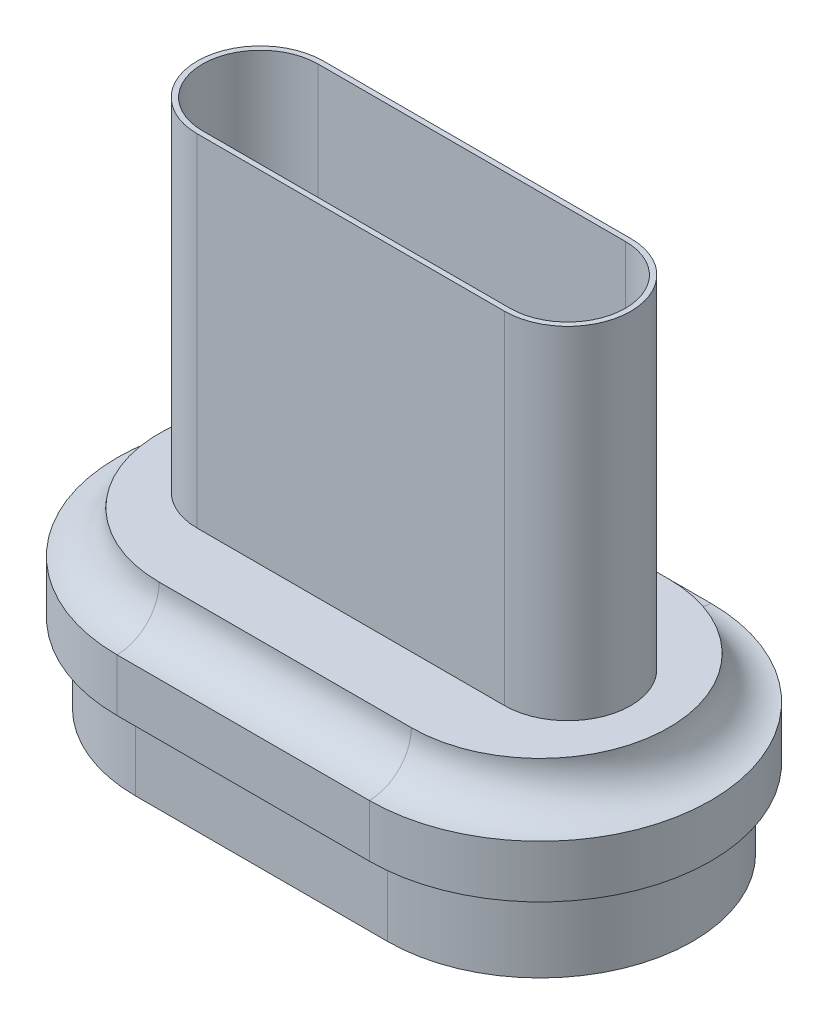
ISO-10303-21;
HEADER;
FILE_DESCRIPTION(('STEP AP214'),'2;1');
FILE_NAME('part.step','',(''),(''),'','','');
FILE_SCHEMA(('AUTOMOTIVE_DESIGN { 1 0 10303 214 1 1 1 1 }'));
ENDSEC;
DATA;
#1=APPLICATION_CONTEXT('core data for automotive mechanical design processes');
#2=APPLICATION_PROTOCOL_DEFINITION('international standard','automotive_design',2000,#1);
#3=PRODUCT_CONTEXT('',#1,'mechanical');
#4=PRODUCT('Part','Part','',(#3));
#5=PRODUCT_RELATED_PRODUCT_CATEGORY('part','',(#4));
#6=PRODUCT_DEFINITION_FORMATION('','',#4);
#7=PRODUCT_DEFINITION_CONTEXT('part definition',#1,'design');
#8=PRODUCT_DEFINITION('design','',#6,#7);
#9=PRODUCT_DEFINITION_SHAPE('','',#8);
#10=(LENGTH_UNIT() NAMED_UNIT(*) SI_UNIT(.MILLI.,.METRE.));
#11=(NAMED_UNIT(*) PLANE_ANGLE_UNIT() SI_UNIT($,.RADIAN.));
#12=(NAMED_UNIT(*) SI_UNIT($,.STERADIAN.) SOLID_ANGLE_UNIT());
#13=UNCERTAINTY_MEASURE_WITH_UNIT(LENGTH_MEASURE(1.E-05),#10,'distance_accuracy_value','');
#14=(GEOMETRIC_REPRESENTATION_CONTEXT(3) GLOBAL_UNCERTAINTY_ASSIGNED_CONTEXT((#13)) GLOBAL_UNIT_ASSIGNED_CONTEXT((#10,
#11,#12)) REPRESENTATION_CONTEXT('',''));
#15=CARTESIAN_POINT('',(0.,0.,0.));
#16=DIRECTION('',(0.,0.,1.));
#17=DIRECTION('',(1.,0.,0.));
#18=AXIS2_PLACEMENT_3D('',#15,#16,#17);
#19=CARTESIAN_POINT('',(-2.4,3.3,0.));
#20=DIRECTION('',(0.,1.,0.));
#21=DIRECTION('',(0.,0.,1.));
#22=AXIS2_PLACEMENT_3D('',#19,#20,#21);
#23=PLANE('',#22);
#24=CARTESIAN_POINT('',(-2.4,3.3,0.));
#25=DIRECTION('',(0.,1.,0.));
#26=DIRECTION('',(0.,0.,1.));
#27=AXIS2_PLACEMENT_3D('',#24,#25,#26);
#28=CIRCLE('',#27,2.45);
#29=CARTESIAN_POINT('',(-2.4,3.3,-2.45));
#30=VERTEX_POINT('',#29);
#31=CARTESIAN_POINT('',(-2.4,3.3,2.45));
#32=VERTEX_POINT('',#31);
#33=EDGE_CURVE('E256',#30,#32,#28,.T.);
#34=ORIENTED_EDGE('',*,*,#33,.T.);
#35=DIRECTION('',(1.,0.,0.));
#36=VECTOR('',#35,1.);
#37=CARTESIAN_POINT('',(-2.4,3.3,2.45));
#38=LINE('',#37,#36);
#39=CARTESIAN_POINT('',(2.4,3.3,2.45));
#40=VERTEX_POINT('',#39);
#41=EDGE_CURVE('E259',#32,#40,#38,.T.);
#42=ORIENTED_EDGE('',*,*,#41,.T.);
#43=CARTESIAN_POINT('',(2.4,3.3,0.));
#44=DIRECTION('',(0.,1.,0.));
#45=DIRECTION('',(0.,0.,1.));
#46=AXIS2_PLACEMENT_3D('',#43,#44,#45);
#47=CIRCLE('',#46,2.45);
#48=CARTESIAN_POINT('',(2.4,3.3,-2.45));
#49=VERTEX_POINT('',#48);
#50=EDGE_CURVE('E261',#40,#49,#47,.T.);
#51=ORIENTED_EDGE('',*,*,#50,.T.);
#52=DIRECTION('',(-1.,0.,0.));
#53=VECTOR('',#52,1.);
#54=CARTESIAN_POINT('',(2.4,3.3,-2.45));
#55=LINE('',#54,#53);
#56=EDGE_CURVE('E263',#49,#30,#55,.T.);
#57=ORIENTED_EDGE('',*,*,#56,.T.);
#58=EDGE_LOOP('',(#34,#42,#51,#57));
#59=FACE_BOUND('',#58,.T.);
#60=DIRECTION('',(1.,0.,0.));
#61=VECTOR('',#60,1.);
#62=CARTESIAN_POINT('',(2.925,3.3,1.2));
#63=LINE('',#62,#61);
#64=CARTESIAN_POINT('',(-2.925,3.3,1.2));
#65=VERTEX_POINT('',#64);
#66=CARTESIAN_POINT('',(2.925,3.3,1.2));
#67=VERTEX_POINT('',#66);
#68=EDGE_CURVE('E243',#65,#67,#63,.T.);
#69=ORIENTED_EDGE('',*,*,#68,.F.);
#70=CARTESIAN_POINT('',(-2.925,3.3,0.));
#71=DIRECTION('',(0.,1.,0.));
#72=DIRECTION('',(0.,0.,-1.));
#73=AXIS2_PLACEMENT_3D('',#70,#71,#72);
#74=CIRCLE('',#73,1.2);
#75=CARTESIAN_POINT('',(-2.925,3.3,-1.2));
#76=VERTEX_POINT('',#75);
#77=EDGE_CURVE('E208',#76,#65,#74,.T.);
#78=ORIENTED_EDGE('',*,*,#77,.F.);
#79=DIRECTION('',(-1.,0.,0.));
#80=VECTOR('',#79,1.);
#81=CARTESIAN_POINT('',(-2.925,3.3,-1.2));
#82=LINE('',#81,#80);
#83=CARTESIAN_POINT('',(2.925,3.3,-1.2));
#84=VERTEX_POINT('',#83);
#85=EDGE_CURVE('E234',#84,#76,#82,.T.);
#86=ORIENTED_EDGE('',*,*,#85,.F.);
#87=CARTESIAN_POINT('',(2.925,3.3,0.));
#88=DIRECTION('',(0.,1.,0.));
#89=DIRECTION('',(0.,0.,-1.));
#90=AXIS2_PLACEMENT_3D('',#87,#88,#89);
#91=CIRCLE('',#90,1.2);
#92=EDGE_CURVE('E245',#67,#84,#91,.T.);
#93=ORIENTED_EDGE('',*,*,#92,.F.);
#94=EDGE_LOOP('',(#69,#78,#86,#93));
#95=FACE_BOUND('',#94,.T.);
#96=ADVANCED_FACE('F38',(#59,#95),#23,.T.);
#97=CARTESIAN_POINT('',(-2.4,0.,0.));
#98=DIRECTION('',(0.,1.,0.));
#99=DIRECTION('',(0.,0.,1.));
#100=AXIS2_PLACEMENT_3D('',#97,#98,#99);
#101=PLANE('',#100);
#102=CARTESIAN_POINT('',(-2.4,0.,0.));
#103=DIRECTION('',(0.,1.,0.));
#104=DIRECTION('',(0.,0.,1.));
#105=AXIS2_PLACEMENT_3D('',#102,#103,#104);
#106=CIRCLE('',#105,2.9);
#107=CARTESIAN_POINT('',(-2.4,0.,-2.9));
#108=VERTEX_POINT('',#107);
#109=CARTESIAN_POINT('',(-2.4,0.,2.9));
#110=VERTEX_POINT('',#109);
#111=EDGE_CURVE('E332',#108,#110,#106,.T.);
#112=ORIENTED_EDGE('',*,*,#111,.F.);
#113=DIRECTION('',(-1.,0.,0.));
#114=VECTOR('',#113,1.);
#115=CARTESIAN_POINT('',(-2.4,0.,-2.9));
#116=LINE('',#115,#114);
#117=CARTESIAN_POINT('',(2.4,0.,-2.9));
#118=VERTEX_POINT('',#117);
#119=EDGE_CURVE('E337',#118,#108,#116,.T.);
#120=ORIENTED_EDGE('',*,*,#119,.F.);
#121=CARTESIAN_POINT('',(2.4,0.,0.));
#122=DIRECTION('',(0.,1.,0.));
#123=DIRECTION('',(0.,0.,1.));
#124=AXIS2_PLACEMENT_3D('',#121,#122,#123);
#125=CIRCLE('',#124,2.9);
#126=CARTESIAN_POINT('',(2.4,0.,2.9));
#127=VERTEX_POINT('',#126);
#128=EDGE_CURVE('E351',#127,#118,#125,.T.);
#129=ORIENTED_EDGE('',*,*,#128,.F.);
#130=DIRECTION('',(1.,0.,0.));
#131=VECTOR('',#130,1.);
#132=CARTESIAN_POINT('',(-2.4,0.,2.9));
#133=LINE('',#132,#131);
#134=EDGE_CURVE('E349',#110,#127,#133,.T.);
#135=ORIENTED_EDGE('',*,*,#134,.F.);
#136=EDGE_LOOP('',(#112,#120,#129,#135));
#137=FACE_BOUND('',#136,.T.);
#138=CARTESIAN_POINT('',(-2.4,0.,0.));
#139=DIRECTION('',(0.,1.,0.));
#140=DIRECTION('',(0.,0.,1.));
#141=AXIS2_PLACEMENT_3D('',#138,#139,#140);
#142=CIRCLE('',#141,1.4);
#143=CARTESIAN_POINT('',(-2.4,0.,-1.4));
#144=VERTEX_POINT('',#143);
#145=CARTESIAN_POINT('',(-2.4,0.,1.4));
#146=VERTEX_POINT('',#145);
#147=EDGE_CURVE('E298',#144,#146,#142,.T.);
#148=ORIENTED_EDGE('',*,*,#147,.T.);
#149=DIRECTION('',(1.,0.,0.));
#150=VECTOR('',#149,1.);
#151=CARTESIAN_POINT('',(-2.4,0.,1.4));
#152=LINE('',#151,#150);
#153=CARTESIAN_POINT('',(2.4,0.,1.4));
#154=VERTEX_POINT('',#153);
#155=EDGE_CURVE('E315',#146,#154,#152,.T.);
#156=ORIENTED_EDGE('',*,*,#155,.T.);
#157=CARTESIAN_POINT('',(2.4,0.,0.));
#158=DIRECTION('',(0.,1.,0.));
#159=DIRECTION('',(0.,0.,1.));
#160=AXIS2_PLACEMENT_3D('',#157,#158,#159);
#161=CIRCLE('',#160,1.4);
#162=CARTESIAN_POINT('',(2.4,0.,-1.4));
#163=VERTEX_POINT('',#162);
#164=EDGE_CURVE('E318',#154,#163,#161,.T.);
#165=ORIENTED_EDGE('',*,*,#164,.T.);
#166=DIRECTION('',(-1.,0.,0.));
#167=VECTOR('',#166,1.);
#168=CARTESIAN_POINT('',(-2.4,0.,-1.4));
#169=LINE('',#168,#167);
#170=EDGE_CURVE('E303',#163,#144,#169,.T.);
#171=ORIENTED_EDGE('',*,*,#170,.T.);
#172=EDGE_LOOP('',(#148,#156,#165,#171));
#173=FACE_BOUND('',#172,.T.);
#174=ADVANCED_FACE('F398',(#137,#173),#101,.F.);
#175=CARTESIAN_POINT('',(-2.4,1.5,0.));
#176=DIRECTION('',(0.,-1.,0.));
#177=DIRECTION('',(0.,0.,-1.));
#178=AXIS2_PLACEMENT_3D('',#175,#176,#177);
#179=CYLINDRICAL_SURFACE('',#178,2.9);
#180=ORIENTED_EDGE('',*,*,#111,.T.);
#181=DIRECTION('',(0.,-1.,0.));
#182=VECTOR('',#181,1.);
#183=CARTESIAN_POINT('',(-2.4,1.5,2.9));
#184=LINE('',#183,#182);
#185=CARTESIAN_POINT('',(-2.4,1.5,2.9));
#186=VERTEX_POINT('',#185);
#187=EDGE_CURVE('E11',#186,#110,#184,.T.);
#188=ORIENTED_EDGE('',*,*,#187,.F.);
#189=CARTESIAN_POINT('',(-2.4,1.5,0.));
#190=DIRECTION('',(0.,1.,0.));
#191=DIRECTION('',(0.,0.,1.));
#192=AXIS2_PLACEMENT_3D('',#189,#190,#191);
#193=CIRCLE('',#192,2.9);
#194=CARTESIAN_POINT('',(-2.4,1.5,-2.9));
#195=VERTEX_POINT('',#194);
#196=EDGE_CURVE('E333',#195,#186,#193,.T.);
#197=ORIENTED_EDGE('',*,*,#196,.F.);
#198=DIRECTION('',(0.,-1.,0.));
#199=VECTOR('',#198,1.);
#200=CARTESIAN_POINT('',(-2.4,1.5,-2.9));
#201=LINE('',#200,#199);
#202=EDGE_CURVE('E346',#195,#108,#201,.T.);
#203=ORIENTED_EDGE('',*,*,#202,.T.);
#204=EDGE_LOOP('',(#180,#188,#197,#203));
#205=FACE_BOUND('',#204,.T.);
#206=ADVANCED_FACE('F468',(#205),#179,.T.);
#207=CARTESIAN_POINT('',(-2.4,1.5,2.9));
#208=DIRECTION('',(0.,0.,-1.));
#209=DIRECTION('',(-1.,0.,0.));
#210=AXIS2_PLACEMENT_3D('',#207,#208,#209);
#211=PLANE('',#210);
#212=ORIENTED_EDGE('',*,*,#134,.T.);
#213=DIRECTION('',(0.,-1.,0.));
#214=VECTOR('',#213,1.);
#215=CARTESIAN_POINT('',(2.4,1.5,2.9));
#216=LINE('',#215,#214);
#217=CARTESIAN_POINT('',(2.4,1.5,2.9));
#218=VERTEX_POINT('',#217);
#219=EDGE_CURVE('E47',#218,#127,#216,.T.);
#220=ORIENTED_EDGE('',*,*,#219,.F.);
#221=DIRECTION('',(1.,0.,0.));
#222=VECTOR('',#221,1.);
#223=CARTESIAN_POINT('',(-2.4,1.5,2.9));
#224=LINE('',#223,#222);
#225=EDGE_CURVE('E336',#186,#218,#224,.T.);
#226=ORIENTED_EDGE('',*,*,#225,.F.);
#227=ORIENTED_EDGE('',*,*,#187,.T.);
#228=EDGE_LOOP('',(#212,#220,#226,#227));
#229=FACE_BOUND('',#228,.T.);
#230=ADVANCED_FACE('F476',(#229),#211,.F.);
#231=CARTESIAN_POINT('',(2.4,1.5,0.));
#232=DIRECTION('',(0.,-1.,0.));
#233=DIRECTION('',(0.,0.,-1.));
#234=AXIS2_PLACEMENT_3D('',#231,#232,#233);
#235=CYLINDRICAL_SURFACE('',#234,2.9);
#236=ORIENTED_EDGE('',*,*,#128,.T.);
#237=DIRECTION('',(0.,-1.,0.));
#238=VECTOR('',#237,1.);
#239=CARTESIAN_POINT('',(2.4,1.5,-2.9));
#240=LINE('',#239,#238);
#241=CARTESIAN_POINT('',(2.4,1.5,-2.9));
#242=VERTEX_POINT('',#241);
#243=EDGE_CURVE('E356',#242,#118,#240,.T.);
#244=ORIENTED_EDGE('',*,*,#243,.F.);
#245=CARTESIAN_POINT('',(2.4,1.5,0.));
#246=DIRECTION('',(0.,1.,0.));
#247=DIRECTION('',(0.,0.,1.));
#248=AXIS2_PLACEMENT_3D('',#245,#246,#247);
#249=CIRCLE('',#248,2.9);
#250=EDGE_CURVE('E340',#218,#242,#249,.T.);
#251=ORIENTED_EDGE('',*,*,#250,.F.);
#252=ORIENTED_EDGE('',*,*,#219,.T.);
#253=EDGE_LOOP('',(#236,#244,#251,#252));
#254=FACE_BOUND('',#253,.T.);
#255=ADVANCED_FACE('F472',(#254),#235,.T.);
#256=CARTESIAN_POINT('',(-2.4,1.5,-2.9));
#257=DIRECTION('',(0.,0.,1.));
#258=DIRECTION('',(1.,0.,0.));
#259=AXIS2_PLACEMENT_3D('',#256,#257,#258);
#260=PLANE('',#259);
#261=ORIENTED_EDGE('',*,*,#119,.T.);
#262=ORIENTED_EDGE('',*,*,#202,.F.);
#263=DIRECTION('',(-1.,0.,0.));
#264=VECTOR('',#263,1.);
#265=CARTESIAN_POINT('',(-2.4,1.5,-2.9));
#266=LINE('',#265,#264);
#267=EDGE_CURVE('E343',#242,#195,#266,.T.);
#268=ORIENTED_EDGE('',*,*,#267,.F.);
#269=ORIENTED_EDGE('',*,*,#243,.T.);
#270=EDGE_LOOP('',(#261,#262,#268,#269));
#271=FACE_BOUND('',#270,.T.);
#272=ADVANCED_FACE('F464',(#271),#260,.F.);
#273=CARTESIAN_POINT('',(-2.4,1.5,0.));
#274=DIRECTION('',(0.,-1.,0.));
#275=DIRECTION('',(0.,0.,-1.));
#276=AXIS2_PLACEMENT_3D('',#273,#274,#275);
#277=CYLINDRICAL_SURFACE('',#276,1.4);
#278=ORIENTED_EDGE('',*,*,#147,.F.);
#279=DIRECTION('',(0.,-1.,0.));
#280=VECTOR('',#279,1.);
#281=CARTESIAN_POINT('',(-2.4,1.5,-1.4));
#282=LINE('',#281,#280);
#283=CARTESIAN_POINT('',(-2.4,1.5,-1.4));
#284=VERTEX_POINT('',#283);
#285=EDGE_CURVE('E312',#284,#144,#282,.T.);
#286=ORIENTED_EDGE('',*,*,#285,.F.);
#287=CARTESIAN_POINT('',(-2.4,1.5,0.));
#288=DIRECTION('',(0.,1.,0.));
#289=DIRECTION('',(0.,0.,1.));
#290=AXIS2_PLACEMENT_3D('',#287,#288,#289);
#291=CIRCLE('',#290,1.4);
#292=CARTESIAN_POINT('',(-2.4,1.5,1.4));
#293=VERTEX_POINT('',#292);
#294=EDGE_CURVE('E299',#284,#293,#291,.T.);
#295=ORIENTED_EDGE('',*,*,#294,.T.);
#296=DIRECTION('',(0.,-1.,0.));
#297=VECTOR('',#296,1.);
#298=CARTESIAN_POINT('',(-2.4,1.5,1.4));
#299=LINE('',#298,#297);
#300=EDGE_CURVE('E329',#293,#146,#299,.T.);
#301=ORIENTED_EDGE('',*,*,#300,.T.);
#302=EDGE_LOOP('',(#278,#286,#295,#301));
#303=FACE_BOUND('',#302,.T.);
#304=ADVANCED_FACE('F460',(#303),#277,.F.);
#305=CARTESIAN_POINT('',(-2.4,1.5,1.4));
#306=DIRECTION('',(0.,0.,-1.));
#307=DIRECTION('',(-1.,0.,0.));
#308=AXIS2_PLACEMENT_3D('',#305,#306,#307);
#309=PLANE('',#308);
#310=ORIENTED_EDGE('',*,*,#155,.F.);
#311=ORIENTED_EDGE('',*,*,#300,.F.);
#312=DIRECTION('',(1.,0.,0.));
#313=VECTOR('',#312,1.);
#314=CARTESIAN_POINT('',(-2.4,1.5,1.4));
#315=LINE('',#314,#313);
#316=CARTESIAN_POINT('',(2.4,1.5,1.4));
#317=VERTEX_POINT('',#316);
#318=EDGE_CURVE('E302',#293,#317,#315,.T.);
#319=ORIENTED_EDGE('',*,*,#318,.T.);
#320=DIRECTION('',(0.,-1.,0.));
#321=VECTOR('',#320,1.);
#322=CARTESIAN_POINT('',(2.4,1.5,1.4));
#323=LINE('',#322,#321);
#324=EDGE_CURVE('E327',#317,#154,#323,.T.);
#325=ORIENTED_EDGE('',*,*,#324,.T.);
#326=EDGE_LOOP('',(#310,#311,#319,#325));
#327=FACE_BOUND('',#326,.T.);
#328=ADVANCED_FACE('F456',(#327),#309,.T.);
#329=CARTESIAN_POINT('',(2.4,1.5,0.));
#330=DIRECTION('',(0.,-1.,0.));
#331=DIRECTION('',(0.,0.,-1.));
#332=AXIS2_PLACEMENT_3D('',#329,#330,#331);
#333=CYLINDRICAL_SURFACE('',#332,1.4);
#334=ORIENTED_EDGE('',*,*,#164,.F.);
#335=ORIENTED_EDGE('',*,*,#324,.F.);
#336=CARTESIAN_POINT('',(2.4,1.5,0.));
#337=DIRECTION('',(0.,1.,0.));
#338=DIRECTION('',(0.,0.,1.));
#339=AXIS2_PLACEMENT_3D('',#336,#337,#338);
#340=CIRCLE('',#339,1.4);
#341=CARTESIAN_POINT('',(2.4,1.5,-1.4));
#342=VERTEX_POINT('',#341);
#343=EDGE_CURVE('E306',#317,#342,#340,.T.);
#344=ORIENTED_EDGE('',*,*,#343,.T.);
#345=DIRECTION('',(0.,-1.,0.));
#346=VECTOR('',#345,1.);
#347=CARTESIAN_POINT('',(2.4,1.5,-1.4));
#348=LINE('',#347,#346);
#349=EDGE_CURVE('E325',#342,#163,#348,.T.);
#350=ORIENTED_EDGE('',*,*,#349,.T.);
#351=EDGE_LOOP('',(#334,#335,#344,#350));
#352=FACE_BOUND('',#351,.T.);
#353=ADVANCED_FACE('F452',(#352),#333,.F.);
#354=CARTESIAN_POINT('',(-2.4,1.5,-1.4));
#355=DIRECTION('',(0.,0.,1.));
#356=DIRECTION('',(1.,0.,0.));
#357=AXIS2_PLACEMENT_3D('',#354,#355,#356);
#358=PLANE('',#357);
#359=ORIENTED_EDGE('',*,*,#170,.F.);
#360=ORIENTED_EDGE('',*,*,#349,.F.);
#361=DIRECTION('',(-1.,0.,0.));
#362=VECTOR('',#361,1.);
#363=CARTESIAN_POINT('',(-2.4,1.5,-1.4));
#364=LINE('',#363,#362);
#365=EDGE_CURVE('E309',#342,#284,#364,.T.);
#366=ORIENTED_EDGE('',*,*,#365,.T.);
#367=ORIENTED_EDGE('',*,*,#285,.T.);
#368=EDGE_LOOP('',(#359,#360,#366,#367));
#369=FACE_BOUND('',#368,.T.);
#370=ADVANCED_FACE('F449',(#369),#358,.T.);
#371=CARTESIAN_POINT('',(2.4,1.5,0.));
#372=DIRECTION('',(0.,1.,0.));
#373=DIRECTION('',(0.,0.,1.));
#374=AXIS2_PLACEMENT_3D('',#371,#372,#373);
#375=PLANE('',#374);
#376=ORIENTED_EDGE('',*,*,#318,.F.);
#377=ORIENTED_EDGE('',*,*,#294,.F.);
#378=ORIENTED_EDGE('',*,*,#365,.F.);
#379=ORIENTED_EDGE('',*,*,#343,.F.);
#380=EDGE_LOOP('',(#376,#377,#378,#379));
#381=FACE_BOUND('',#380,.T.);
#382=ADVANCED_FACE('F439',(#381),#375,.F.);
#383=CARTESIAN_POINT('',(2.4,2.5,0.));
#384=DIRECTION('',(0.,-1.,0.));
#385=DIRECTION('',(0.,0.,-1.));
#386=AXIS2_PLACEMENT_3D('',#383,#384,#385);
#387=CYLINDRICAL_SURFACE('',#386,3.25);
#388=CARTESIAN_POINT('',(2.4,1.5,0.));
#389=DIRECTION('',(0.,1.,0.));
#390=DIRECTION('',(0.,0.,1.));
#391=AXIS2_PLACEMENT_3D('',#388,#389,#390);
#392=CIRCLE('',#391,3.25);
#393=CARTESIAN_POINT('',(2.4,1.5,3.25));
#394=VERTEX_POINT('',#393);
#395=CARTESIAN_POINT('',(2.4,1.5,-3.25));
#396=VERTEX_POINT('',#395);
#397=EDGE_CURVE('E265',#394,#396,#392,.T.);
#398=ORIENTED_EDGE('',*,*,#397,.T.);
#399=DIRECTION('',(0.,-1.,0.));
#400=VECTOR('',#399,1.);
#401=CARTESIAN_POINT('',(2.4,2.5,-3.25));
#402=LINE('',#401,#400);
#403=CARTESIAN_POINT('',(2.4,2.5,-3.25));
#404=VERTEX_POINT('',#403);
#405=EDGE_CURVE('E295',#404,#396,#402,.T.);
#406=ORIENTED_EDGE('',*,*,#405,.F.);
#407=CARTESIAN_POINT('',(2.4,2.5,0.));
#408=DIRECTION('',(0.,1.,0.));
#409=DIRECTION('',(0.,0.,1.));
#410=AXIS2_PLACEMENT_3D('',#407,#408,#409);
#411=CIRCLE('',#410,3.25);
#412=CARTESIAN_POINT('',(2.4,2.5,3.25));
#413=VERTEX_POINT('',#412);
#414=EDGE_CURVE('E266',#413,#404,#411,.T.);
#415=ORIENTED_EDGE('',*,*,#414,.F.);
#416=DIRECTION('',(0.,-1.,0.));
#417=VECTOR('',#416,1.);
#418=CARTESIAN_POINT('',(2.4,2.5,3.25));
#419=LINE('',#418,#417);
#420=EDGE_CURVE('E279',#413,#394,#419,.T.);
#421=ORIENTED_EDGE('',*,*,#420,.T.);
#422=EDGE_LOOP('',(#398,#406,#415,#421));
#423=FACE_BOUND('',#422,.T.);
#424=ADVANCED_FACE('F381',(#423),#387,.T.);
#425=CARTESIAN_POINT('',(2.4,2.5,-3.25));
#426=DIRECTION('',(0.,0.,1.));
#427=DIRECTION('',(1.,0.,0.));
#428=AXIS2_PLACEMENT_3D('',#425,#426,#427);
#429=PLANE('',#428);
#430=DIRECTION('',(-1.,0.,0.));
#431=VECTOR('',#430,1.);
#432=CARTESIAN_POINT('',(2.4,1.5,-3.25));
#433=LINE('',#432,#431);
#434=CARTESIAN_POINT('',(-2.4,1.5,-3.25));
#435=VERTEX_POINT('',#434);
#436=EDGE_CURVE('E282',#396,#435,#433,.T.);
#437=ORIENTED_EDGE('',*,*,#436,.T.);
#438=DIRECTION('',(0.,-1.,0.));
#439=VECTOR('',#438,1.);
#440=CARTESIAN_POINT('',(-2.4,2.5,-3.25));
#441=LINE('',#440,#439);
#442=CARTESIAN_POINT('',(-2.4,2.5,-3.25));
#443=VERTEX_POINT('',#442);
#444=EDGE_CURVE('E292',#443,#435,#441,.T.);
#445=ORIENTED_EDGE('',*,*,#444,.F.);
#446=DIRECTION('',(-1.,0.,0.));
#447=VECTOR('',#446,1.);
#448=CARTESIAN_POINT('',(2.4,2.5,-3.25));
#449=LINE('',#448,#447);
#450=EDGE_CURVE('E269',#404,#443,#449,.T.);
#451=ORIENTED_EDGE('',*,*,#450,.F.);
#452=ORIENTED_EDGE('',*,*,#405,.T.);
#453=EDGE_LOOP('',(#437,#445,#451,#452));
#454=FACE_BOUND('',#453,.T.);
#455=ADVANCED_FACE('F384',(#454),#429,.F.);
#456=CARTESIAN_POINT('',(-2.4,2.5,0.));
#457=DIRECTION('',(0.,-1.,0.));
#458=DIRECTION('',(0.,0.,-1.));
#459=AXIS2_PLACEMENT_3D('',#456,#457,#458);
#460=CYLINDRICAL_SURFACE('',#459,3.25);
#461=CARTESIAN_POINT('',(-2.4,1.5,0.));
#462=DIRECTION('',(0.,1.,0.));
#463=DIRECTION('',(0.,0.,1.));
#464=AXIS2_PLACEMENT_3D('',#461,#462,#463);
#465=CIRCLE('',#464,3.25);
#466=CARTESIAN_POINT('',(-2.4,1.5,3.25));
#467=VERTEX_POINT('',#466);
#468=EDGE_CURVE('E284',#435,#467,#465,.T.);
#469=ORIENTED_EDGE('',*,*,#468,.T.);
#470=DIRECTION('',(0.,-1.,0.));
#471=VECTOR('',#470,1.);
#472=CARTESIAN_POINT('',(-2.4,2.5,3.25));
#473=LINE('',#472,#471);
#474=CARTESIAN_POINT('',(-2.4,2.5,3.25));
#475=VERTEX_POINT('',#474);
#476=EDGE_CURVE('E289',#475,#467,#473,.T.);
#477=ORIENTED_EDGE('',*,*,#476,.F.);
#478=CARTESIAN_POINT('',(-2.4,2.5,0.));
#479=DIRECTION('',(0.,1.,0.));
#480=DIRECTION('',(0.,0.,1.));
#481=AXIS2_PLACEMENT_3D('',#478,#479,#480);
#482=CIRCLE('',#481,3.25);
#483=EDGE_CURVE('E273',#443,#475,#482,.T.);
#484=ORIENTED_EDGE('',*,*,#483,.F.);
#485=ORIENTED_EDGE('',*,*,#444,.T.);
#486=EDGE_LOOP('',(#469,#477,#484,#485));
#487=FACE_BOUND('',#486,.T.);
#488=ADVANCED_FACE('F388',(#487),#460,.T.);
#489=CARTESIAN_POINT('',(-2.4,2.5,3.25));
#490=DIRECTION('',(0.,0.,-1.));
#491=DIRECTION('',(-1.,0.,0.));
#492=AXIS2_PLACEMENT_3D('',#489,#490,#491);
#493=PLANE('',#492);
#494=DIRECTION('',(1.,0.,0.));
#495=VECTOR('',#494,1.);
#496=CARTESIAN_POINT('',(-2.4,1.5,3.25));
#497=LINE('',#496,#495);
#498=EDGE_CURVE('E270',#467,#394,#497,.T.);
#499=ORIENTED_EDGE('',*,*,#498,.T.);
#500=ORIENTED_EDGE('',*,*,#420,.F.);
#501=DIRECTION('',(1.,0.,0.));
#502=VECTOR('',#501,1.);
#503=CARTESIAN_POINT('',(-2.4,2.5,3.25));
#504=LINE('',#503,#502);
#505=EDGE_CURVE('E276',#475,#413,#504,.T.);
#506=ORIENTED_EDGE('',*,*,#505,.F.);
#507=ORIENTED_EDGE('',*,*,#476,.T.);
#508=EDGE_LOOP('',(#499,#500,#506,#507));
#509=FACE_BOUND('',#508,.T.);
#510=ADVANCED_FACE('F437',(#509),#493,.F.);
#511=ORIENTED_EDGE('',*,*,#267,.T.);
#512=ORIENTED_EDGE('',*,*,#196,.T.);
#513=ORIENTED_EDGE('',*,*,#225,.T.);
#514=ORIENTED_EDGE('',*,*,#250,.T.);
#515=EDGE_LOOP('',(#511,#512,#513,#514));
#516=FACE_BOUND('',#515,.T.);
#517=ORIENTED_EDGE('',*,*,#397,.F.);
#518=ORIENTED_EDGE('',*,*,#498,.F.);
#519=ORIENTED_EDGE('',*,*,#468,.F.);
#520=ORIENTED_EDGE('',*,*,#436,.F.);
#521=EDGE_LOOP('',(#517,#518,#519,#520));
#522=FACE_BOUND('',#521,.T.);
#523=ADVANCED_FACE('F434',(#516,#522),#375,.F.);
#524=CARTESIAN_POINT('',(-2.925,9.8,0.));
#525=DIRECTION('',(0.,-1.,0.));
#526=DIRECTION('',(0.,0.,-1.));
#527=AXIS2_PLACEMENT_3D('',#524,#525,#526);
#528=PLANE('',#527);
#529=CARTESIAN_POINT('',(-2.925,9.8,0.));
#530=DIRECTION('',(0.,1.,0.));
#531=DIRECTION('',(0.,0.,-1.));
#532=AXIS2_PLACEMENT_3D('',#529,#530,#531);
#533=CIRCLE('',#532,1.2);
#534=CARTESIAN_POINT('',(-2.925,9.8,-1.2));
#535=VERTEX_POINT('',#534);
#536=CARTESIAN_POINT('',(-2.925,9.8,1.2));
#537=VERTEX_POINT('',#536);
#538=EDGE_CURVE('E230',#535,#537,#533,.T.);
#539=ORIENTED_EDGE('',*,*,#538,.T.);
#540=DIRECTION('',(1.,0.,0.));
#541=VECTOR('',#540,1.);
#542=CARTESIAN_POINT('',(2.925,9.8,1.2));
#543=LINE('',#542,#541);
#544=CARTESIAN_POINT('',(2.925,9.8,1.2));
#545=VERTEX_POINT('',#544);
#546=EDGE_CURVE('E233',#537,#545,#543,.T.);
#547=ORIENTED_EDGE('',*,*,#546,.T.);
#548=CARTESIAN_POINT('',(2.925,9.8,0.));
#549=DIRECTION('',(0.,1.,0.));
#550=DIRECTION('',(0.,0.,-1.));
#551=AXIS2_PLACEMENT_3D('',#548,#549,#550);
#552=CIRCLE('',#551,1.2);
#553=CARTESIAN_POINT('',(2.925,9.8,-1.2));
#554=VERTEX_POINT('',#553);
#555=EDGE_CURVE('E236',#545,#554,#552,.T.);
#556=ORIENTED_EDGE('',*,*,#555,.T.);
#557=DIRECTION('',(-1.,0.,0.));
#558=VECTOR('',#557,1.);
#559=CARTESIAN_POINT('',(-2.925,9.8,-1.2));
#560=LINE('',#559,#558);
#561=EDGE_CURVE('E238',#554,#535,#560,.T.);
#562=ORIENTED_EDGE('',*,*,#561,.T.);
#563=EDGE_LOOP('',(#539,#547,#556,#562));
#564=FACE_BOUND('',#563,.T.);
#565=CARTESIAN_POINT('',(-2.925,9.8,0.));
#566=DIRECTION('',(0.,1.,0.));
#567=DIRECTION('',(0.,0.,-1.));
#568=AXIS2_PLACEMENT_3D('',#565,#566,#567);
#569=CIRCLE('',#568,1.1);
#570=CARTESIAN_POINT('',(-2.925,9.8,-1.1));
#571=VERTEX_POINT('',#570);
#572=CARTESIAN_POINT('',(-2.925,9.8,1.1));
#573=VERTEX_POINT('',#572);
#574=EDGE_CURVE('E191',#571,#573,#569,.T.);
#575=ORIENTED_EDGE('',*,*,#574,.F.);
#576=DIRECTION('',(-1.,0.,0.));
#577=VECTOR('',#576,1.);
#578=CARTESIAN_POINT('',(-2.925,9.8,-1.1));
#579=LINE('',#578,#577);
#580=CARTESIAN_POINT('',(2.925,9.8,-1.1));
#581=VERTEX_POINT('',#580);
#582=EDGE_CURVE('E216',#581,#571,#579,.T.);
#583=ORIENTED_EDGE('',*,*,#582,.F.);
#584=CARTESIAN_POINT('',(2.925,9.8,0.));
#585=DIRECTION('',(0.,1.,0.));
#586=DIRECTION('',(0.,0.,-1.));
#587=AXIS2_PLACEMENT_3D('',#584,#585,#586);
#588=CIRCLE('',#587,1.1);
#589=CARTESIAN_POINT('',(2.925,9.8,1.1));
#590=VERTEX_POINT('',#589);
#591=EDGE_CURVE('E214',#590,#581,#588,.T.);
#592=ORIENTED_EDGE('',*,*,#591,.F.);
#593=DIRECTION('',(1.,0.,0.));
#594=VECTOR('',#593,1.);
#595=CARTESIAN_POINT('',(2.925,9.8,1.1));
#596=LINE('',#595,#594);
#597=EDGE_CURVE('E200',#573,#590,#596,.T.);
#598=ORIENTED_EDGE('',*,*,#597,.F.);
#599=EDGE_LOOP('',(#575,#583,#592,#598));
#600=FACE_BOUND('',#599,.T.);
#601=ADVANCED_FACE('F212',(#564,#600),#528,.F.);
#602=CARTESIAN_POINT('',(-2.925,9.8,0.));
#603=DIRECTION('',(0.,-1.,0.));
#604=DIRECTION('',(0.,0.,-1.));
#605=AXIS2_PLACEMENT_3D('',#602,#603,#604);
#606=CYLINDRICAL_SURFACE('',#605,1.2);
#607=ORIENTED_EDGE('',*,*,#77,.T.);
#608=DIRECTION('',(0.,-1.,0.));
#609=VECTOR('',#608,1.);
#610=CARTESIAN_POINT('',(-2.925,9.8,1.2));
#611=LINE('',#610,#609);
#612=EDGE_CURVE('E254',#537,#65,#611,.T.);
#613=ORIENTED_EDGE('',*,*,#612,.F.);
#614=ORIENTED_EDGE('',*,*,#538,.F.);
#615=DIRECTION('',(0.,-1.,0.));
#616=VECTOR('',#615,1.);
#617=CARTESIAN_POINT('',(-2.925,9.8,-1.2));
#618=LINE('',#617,#616);
#619=EDGE_CURVE('E240',#535,#76,#618,.T.);
#620=ORIENTED_EDGE('',*,*,#619,.T.);
#621=EDGE_LOOP('',(#607,#613,#614,#620));
#622=FACE_BOUND('',#621,.T.);
#623=ADVANCED_FACE('F416',(#622),#606,.T.);
#624=CARTESIAN_POINT('',(2.925,9.8,1.2));
#625=DIRECTION('',(0.,0.,-1.));
#626=DIRECTION('',(-1.,0.,0.));
#627=AXIS2_PLACEMENT_3D('',#624,#625,#626);
#628=PLANE('',#627);
#629=ORIENTED_EDGE('',*,*,#68,.T.);
#630=DIRECTION('',(0.,-1.,0.));
#631=VECTOR('',#630,1.);
#632=CARTESIAN_POINT('',(2.925,9.8,1.2));
#633=LINE('',#632,#631);
#634=EDGE_CURVE('E251',#545,#67,#633,.T.);
#635=ORIENTED_EDGE('',*,*,#634,.F.);
#636=ORIENTED_EDGE('',*,*,#546,.F.);
#637=ORIENTED_EDGE('',*,*,#612,.T.);
#638=EDGE_LOOP('',(#629,#635,#636,#637));
#639=FACE_BOUND('',#638,.T.);
#640=ADVANCED_FACE('F407',(#639),#628,.F.);
#641=CARTESIAN_POINT('',(2.925,9.8,0.));
#642=DIRECTION('',(0.,-1.,0.));
#643=DIRECTION('',(0.,0.,-1.));
#644=AXIS2_PLACEMENT_3D('',#641,#642,#643);
#645=CYLINDRICAL_SURFACE('',#644,1.2);
#646=ORIENTED_EDGE('',*,*,#92,.T.);
#647=DIRECTION('',(0.,-1.,0.));
#648=VECTOR('',#647,1.);
#649=CARTESIAN_POINT('',(2.925,9.8,-1.2));
#650=LINE('',#649,#648);
#651=EDGE_CURVE('E55',#554,#84,#650,.T.);
#652=ORIENTED_EDGE('',*,*,#651,.F.);
#653=ORIENTED_EDGE('',*,*,#555,.F.);
#654=ORIENTED_EDGE('',*,*,#634,.T.);
#655=EDGE_LOOP('',(#646,#652,#653,#654));
#656=FACE_BOUND('',#655,.T.);
#657=ADVANCED_FACE('F411',(#656),#645,.T.);
#658=CARTESIAN_POINT('',(-2.925,9.8,-1.2));
#659=DIRECTION('',(0.,0.,1.));
#660=DIRECTION('',(1.,0.,0.));
#661=AXIS2_PLACEMENT_3D('',#658,#659,#660);
#662=PLANE('',#661);
#663=ORIENTED_EDGE('',*,*,#85,.T.);
#664=ORIENTED_EDGE('',*,*,#619,.F.);
#665=ORIENTED_EDGE('',*,*,#561,.F.);
#666=ORIENTED_EDGE('',*,*,#651,.T.);
#667=EDGE_LOOP('',(#663,#664,#665,#666));
#668=FACE_BOUND('',#667,.T.);
#669=ADVANCED_FACE('F417',(#668),#662,.F.);
#670=CARTESIAN_POINT('',(-2.925,9.8,0.));
#671=DIRECTION('',(0.,-1.,0.));
#672=DIRECTION('',(0.,0.,-1.));
#673=AXIS2_PLACEMENT_3D('',#670,#671,#672);
#674=CYLINDRICAL_SURFACE('',#673,1.1);
#675=CARTESIAN_POINT('',(-2.925,3.3,0.));
#676=DIRECTION('',(0.,1.,0.));
#677=DIRECTION('',(0.,0.,-1.));
#678=AXIS2_PLACEMENT_3D('',#675,#676,#677);
#679=CIRCLE('',#678,1.1);
#680=CARTESIAN_POINT('',(-2.925,3.3,-1.1));
#681=VERTEX_POINT('',#680);
#682=CARTESIAN_POINT('',(-2.925,3.3,1.1));
#683=VERTEX_POINT('',#682);
#684=EDGE_CURVE('E63',#681,#683,#679,.T.);
#685=ORIENTED_EDGE('',*,*,#684,.F.);
#686=DIRECTION('',(0.,-1.,0.));
#687=VECTOR('',#686,1.);
#688=CARTESIAN_POINT('',(-2.925,9.8,-1.1));
#689=LINE('',#688,#687);
#690=EDGE_CURVE('E196',#571,#681,#689,.T.);
#691=ORIENTED_EDGE('',*,*,#690,.F.);
#692=ORIENTED_EDGE('',*,*,#574,.T.);
#693=DIRECTION('',(0.,-1.,0.));
#694=VECTOR('',#693,1.);
#695=CARTESIAN_POINT('',(-2.925,9.8,1.1));
#696=LINE('',#695,#694);
#697=EDGE_CURVE('E194',#573,#683,#696,.T.);
#698=ORIENTED_EDGE('',*,*,#697,.T.);
#699=EDGE_LOOP('',(#685,#691,#692,#698));
#700=FACE_BOUND('',#699,.T.);
#701=ADVANCED_FACE('F193',(#700),#674,.F.);
#702=CARTESIAN_POINT('',(2.925,9.8,1.1));
#703=DIRECTION('',(0.,0.,-1.));
#704=DIRECTION('',(-1.,0.,0.));
#705=AXIS2_PLACEMENT_3D('',#702,#703,#704);
#706=PLANE('',#705);
#707=DIRECTION('',(1.,0.,0.));
#708=VECTOR('',#707,1.);
#709=CARTESIAN_POINT('',(2.925,3.3,1.1));
#710=LINE('',#709,#708);
#711=CARTESIAN_POINT('',(2.925,3.3,1.1));
#712=VERTEX_POINT('',#711);
#713=EDGE_CURVE('E207',#683,#712,#710,.T.);
#714=ORIENTED_EDGE('',*,*,#713,.F.);
#715=ORIENTED_EDGE('',*,*,#697,.F.);
#716=ORIENTED_EDGE('',*,*,#597,.T.);
#717=DIRECTION('',(0.,-1.,0.));
#718=VECTOR('',#717,1.);
#719=CARTESIAN_POINT('',(2.925,9.8,1.1));
#720=LINE('',#719,#718);
#721=EDGE_CURVE('E209',#590,#712,#720,.T.);
#722=ORIENTED_EDGE('',*,*,#721,.T.);
#723=EDGE_LOOP('',(#714,#715,#716,#722));
#724=FACE_BOUND('',#723,.T.);
#725=ADVANCED_FACE('F204',(#724),#706,.T.);
#726=CARTESIAN_POINT('',(2.925,9.8,0.));
#727=DIRECTION('',(0.,-1.,0.));
#728=DIRECTION('',(0.,0.,-1.));
#729=AXIS2_PLACEMENT_3D('',#726,#727,#728);
#730=CYLINDRICAL_SURFACE('',#729,1.1);
#731=CARTESIAN_POINT('',(2.925,3.3,0.));
#732=DIRECTION('',(0.,1.,0.));
#733=DIRECTION('',(0.,0.,-1.));
#734=AXIS2_PLACEMENT_3D('',#731,#732,#733);
#735=CIRCLE('',#734,1.1);
#736=CARTESIAN_POINT('',(2.925,3.3,-1.1));
#737=VERTEX_POINT('',#736);
#738=EDGE_CURVE('E222',#712,#737,#735,.T.);
#739=ORIENTED_EDGE('',*,*,#738,.F.);
#740=ORIENTED_EDGE('',*,*,#721,.F.);
#741=ORIENTED_EDGE('',*,*,#591,.T.);
#742=DIRECTION('',(0.,-1.,0.));
#743=VECTOR('',#742,1.);
#744=CARTESIAN_POINT('',(2.925,9.8,-1.1));
#745=LINE('',#744,#743);
#746=EDGE_CURVE('E226',#581,#737,#745,.T.);
#747=ORIENTED_EDGE('',*,*,#746,.T.);
#748=EDGE_LOOP('',(#739,#740,#741,#747));
#749=FACE_BOUND('',#748,.T.);
#750=ADVANCED_FACE('F505',(#749),#730,.F.);
#751=CARTESIAN_POINT('',(-2.925,9.8,-1.1));
#752=DIRECTION('',(0.,0.,1.));
#753=DIRECTION('',(1.,0.,0.));
#754=AXIS2_PLACEMENT_3D('',#751,#752,#753);
#755=PLANE('',#754);
#756=DIRECTION('',(-1.,0.,0.));
#757=VECTOR('',#756,1.);
#758=CARTESIAN_POINT('',(-2.925,3.3,-1.1));
#759=LINE('',#758,#757);
#760=EDGE_CURVE('E201',#737,#681,#759,.T.);
#761=ORIENTED_EDGE('',*,*,#760,.F.);
#762=ORIENTED_EDGE('',*,*,#746,.F.);
#763=ORIENTED_EDGE('',*,*,#582,.T.);
#764=ORIENTED_EDGE('',*,*,#690,.T.);
#765=EDGE_LOOP('',(#761,#762,#763,#764));
#766=FACE_BOUND('',#765,.T.);
#767=ADVANCED_FACE('F433',(#766),#755,.T.);
#768=ORIENTED_EDGE('',*,*,#684,.T.);
#769=ORIENTED_EDGE('',*,*,#713,.T.);
#770=ORIENTED_EDGE('',*,*,#738,.T.);
#771=ORIENTED_EDGE('',*,*,#760,.T.);
#772=EDGE_LOOP('',(#768,#769,#770,#771));
#773=FACE_BOUND('',#772,.T.);
#774=ADVANCED_FACE('F400',(#773),#23,.T.);
#775=CARTESIAN_POINT('',(2.4,3.3,0.));
#776=DIRECTION('',(0.,1.,0.));
#777=DIRECTION('',(0.,0.,1.));
#778=AXIS2_PLACEMENT_3D('',#775,#776,#777);
#779=TOROIDAL_SURFACE('',#778,3.25,0.8);
#780=CARTESIAN_POINT('',(2.4,3.3,3.25));
#781=DIRECTION('',(1.,0.,0.));
#782=DIRECTION('',(0.,0.,-1.));
#783=AXIS2_PLACEMENT_3D('',#780,#781,#782);
#784=CIRCLE('',#783,0.8);
#785=EDGE_CURVE('E364',#413,#40,#784,.T.);
#786=ORIENTED_EDGE('',*,*,#785,.F.);
#787=ORIENTED_EDGE('',*,*,#414,.T.);
#788=CARTESIAN_POINT('',(2.4,3.3,-3.25));
#789=DIRECTION('',(1.,0.,0.));
#790=DIRECTION('',(0.,0.,-1.));
#791=AXIS2_PLACEMENT_3D('',#788,#789,#790);
#792=CIRCLE('',#791,0.8);
#793=EDGE_CURVE('E42',#49,#404,#792,.T.);
#794=ORIENTED_EDGE('',*,*,#793,.F.);
#795=ORIENTED_EDGE('',*,*,#50,.F.);
#796=EDGE_LOOP('',(#786,#787,#794,#795));
#797=FACE_BOUND('',#796,.T.);
#798=ADVANCED_FACE('F40',(#797),#779,.F.);
#799=CARTESIAN_POINT('',(2.4,3.3,-3.25));
#800=DIRECTION('',(-1.,0.,0.));
#801=DIRECTION('',(0.,0.,1.));
#802=AXIS2_PLACEMENT_3D('',#799,#800,#801);
#803=CYLINDRICAL_SURFACE('',#802,0.8);
#804=ORIENTED_EDGE('',*,*,#793,.T.);
#805=ORIENTED_EDGE('',*,*,#450,.T.);
#806=CARTESIAN_POINT('',(-2.4,3.3,-3.25));
#807=DIRECTION('',(1.,0.,0.));
#808=DIRECTION('',(0.,0.,-1.));
#809=AXIS2_PLACEMENT_3D('',#806,#807,#808);
#810=CIRCLE('',#809,0.8);
#811=EDGE_CURVE('E363',#30,#443,#810,.T.);
#812=ORIENTED_EDGE('',*,*,#811,.F.);
#813=ORIENTED_EDGE('',*,*,#56,.F.);
#814=EDGE_LOOP('',(#804,#805,#812,#813));
#815=FACE_BOUND('',#814,.T.);
#816=ADVANCED_FACE('F373',(#815),#803,.F.);
#817=CARTESIAN_POINT('',(-2.4,3.3,3.25));
#818=DIRECTION('',(1.,0.,0.));
#819=DIRECTION('',(0.,0.,-1.));
#820=AXIS2_PLACEMENT_3D('',#817,#818,#819);
#821=CYLINDRICAL_SURFACE('',#820,0.8);
#822=ORIENTED_EDGE('',*,*,#785,.T.);
#823=ORIENTED_EDGE('',*,*,#41,.F.);
#824=CARTESIAN_POINT('',(-2.4,3.3,3.25));
#825=DIRECTION('',(1.,0.,0.));
#826=DIRECTION('',(0.,0.,-1.));
#827=AXIS2_PLACEMENT_3D('',#824,#825,#826);
#828=CIRCLE('',#827,0.8);
#829=EDGE_CURVE('E361',#475,#32,#828,.T.);
#830=ORIENTED_EDGE('',*,*,#829,.F.);
#831=ORIENTED_EDGE('',*,*,#505,.T.);
#832=EDGE_LOOP('',(#822,#823,#830,#831));
#833=FACE_BOUND('',#832,.T.);
#834=ADVANCED_FACE('F394',(#833),#821,.F.);
#835=CARTESIAN_POINT('',(-2.4,3.3,0.));
#836=DIRECTION('',(0.,1.,0.));
#837=DIRECTION('',(0.,0.,1.));
#838=AXIS2_PLACEMENT_3D('',#835,#836,#837);
#839=TOROIDAL_SURFACE('',#838,3.25,0.8);
#840=ORIENTED_EDGE('',*,*,#811,.T.);
#841=ORIENTED_EDGE('',*,*,#483,.T.);
#842=ORIENTED_EDGE('',*,*,#829,.T.);
#843=ORIENTED_EDGE('',*,*,#33,.F.);
#844=EDGE_LOOP('',(#840,#841,#842,#843));
#845=FACE_BOUND('',#844,.T.);
#846=ADVANCED_FACE('F392',(#845),#839,.F.);
#847=CLOSED_SHELL('',(#96,#174,#206,#230,#255,#272,#304,#328,#353,#370,#382,#424,#455,#488,#510,
#523,#601,#623,#640,#657,#669,#701,#725,#750,#767,#774,#798,#816,#834,#846));
#848=MANIFOLD_SOLID_BREP('B2',#847);
#849=ADVANCED_BREP_SHAPE_REPRESENTATION('',(#18,#848),#14);
#850=SHAPE_DEFINITION_REPRESENTATION(#9,#849);
ENDSEC;
END-ISO-10303-21;
